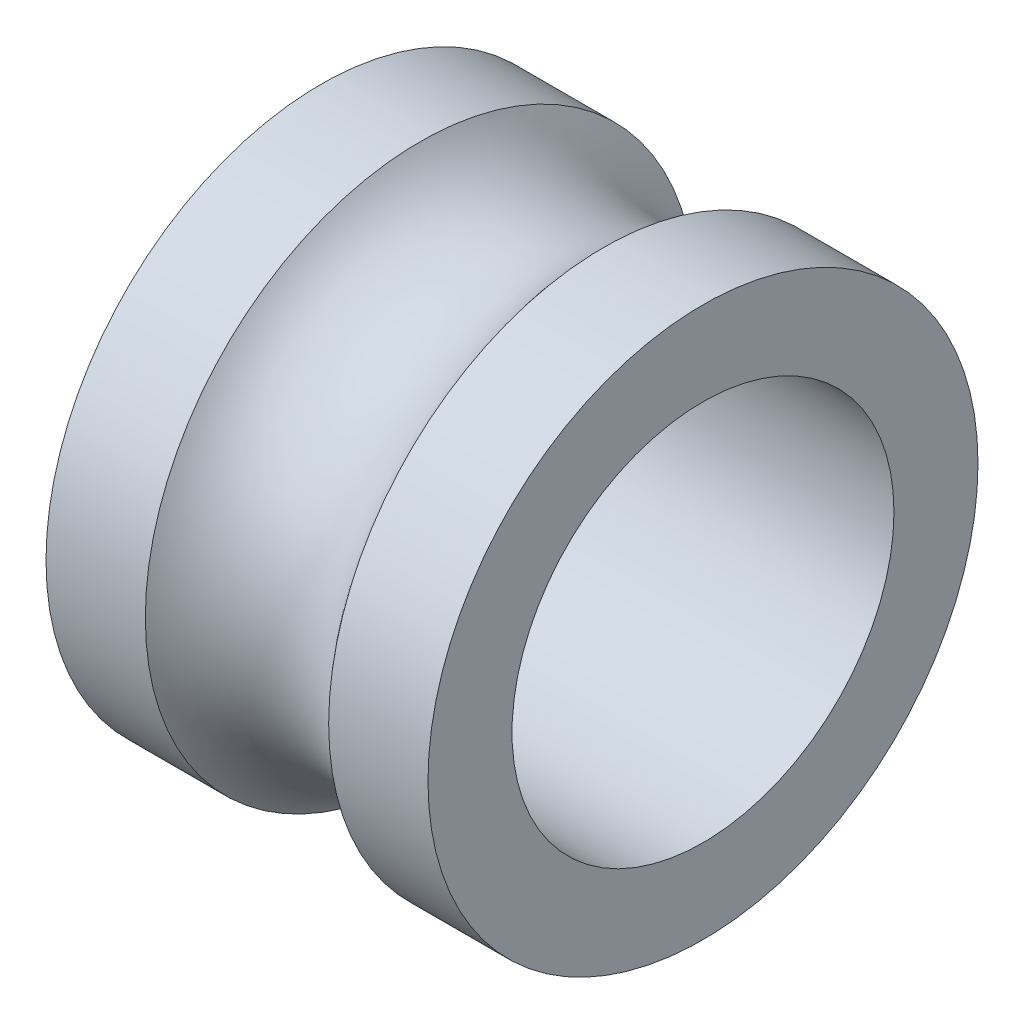
ISO-10303-21;
HEADER;
FILE_DESCRIPTION(('STEP AP214'),'2;1');
FILE_NAME('part.step','',(''),(''),'','','');
FILE_SCHEMA(('AUTOMOTIVE_DESIGN { 1 0 10303 214 1 1 1 1 }'));
ENDSEC;
DATA;
#1=APPLICATION_CONTEXT('core data for automotive mechanical design processes');
#2=APPLICATION_PROTOCOL_DEFINITION('international standard','automotive_design',2000,#1);
#3=PRODUCT_CONTEXT('',#1,'mechanical');
#4=PRODUCT('Part','Part','',(#3));
#5=PRODUCT_RELATED_PRODUCT_CATEGORY('part','',(#4));
#6=PRODUCT_DEFINITION_FORMATION('','',#4);
#7=PRODUCT_DEFINITION_CONTEXT('part definition',#1,'design');
#8=PRODUCT_DEFINITION('design','',#6,#7);
#9=PRODUCT_DEFINITION_SHAPE('','',#8);
#10=(LENGTH_UNIT() NAMED_UNIT(*) SI_UNIT(.MILLI.,.METRE.));
#11=(NAMED_UNIT(*) PLANE_ANGLE_UNIT() SI_UNIT($,.RADIAN.));
#12=(NAMED_UNIT(*) SI_UNIT($,.STERADIAN.) SOLID_ANGLE_UNIT());
#13=UNCERTAINTY_MEASURE_WITH_UNIT(LENGTH_MEASURE(1.E-05),#10,'distance_accuracy_value','');
#14=(GEOMETRIC_REPRESENTATION_CONTEXT(3) GLOBAL_UNCERTAINTY_ASSIGNED_CONTEXT((#13)) GLOBAL_UNIT_ASSIGNED_CONTEXT((#10,
#11,#12)) REPRESENTATION_CONTEXT('',''));
#15=CARTESIAN_POINT('',(0.,0.,0.));
#16=DIRECTION('',(0.,0.,1.));
#17=DIRECTION('',(1.,0.,0.));
#18=AXIS2_PLACEMENT_3D('',#15,#16,#17);
#19=CARTESIAN_POINT('',(2.5,3.6,0.));
#20=DIRECTION('',(1.,0.,0.));
#21=DIRECTION('',(0.,0.,-1.));
#22=AXIS2_PLACEMENT_3D('',#19,#20,#21);
#23=PLANE('',#22);
#24=CARTESIAN_POINT('',(2.5,0.,0.));
#25=DIRECTION('',(1.,0.,0.));
#26=DIRECTION('',(0.,0.,-1.));
#27=AXIS2_PLACEMENT_3D('',#24,#25,#26);
#28=CIRCLE('',#27,3.6);
#29=CARTESIAN_POINT('',(2.5,0.,-3.6));
#30=VERTEX_POINT('',#29);
#31=EDGE_CURVE('E52',#30,#30,#28,.T.);
#32=ORIENTED_EDGE('',*,*,#31,.T.);
#33=EDGE_LOOP('',(#32));
#34=FACE_BOUND('',#33,.T.);
#35=CARTESIAN_POINT('',(2.5,0.,0.));
#36=DIRECTION('',(1.,0.,0.));
#37=DIRECTION('',(0.,0.,-1.));
#38=AXIS2_PLACEMENT_3D('',#35,#36,#37);
#39=CIRCLE('',#38,2.5);
#40=CARTESIAN_POINT('',(2.5,0.,-2.5));
#41=VERTEX_POINT('',#40);
#42=EDGE_CURVE('E10',#41,#41,#39,.T.);
#43=ORIENTED_EDGE('',*,*,#42,.F.);
#44=EDGE_LOOP('',(#43));
#45=FACE_BOUND('',#44,.T.);
#46=ADVANCED_FACE('F30',(#34,#45),#23,.T.);
#47=CARTESIAN_POINT('',(0.,0.,0.));
#48=DIRECTION('',(1.,0.,0.));
#49=DIRECTION('',(0.,0.,-1.));
#50=AXIS2_PLACEMENT_3D('',#47,#48,#49);
#51=CYLINDRICAL_SURFACE('',#50,2.5);
#52=ORIENTED_EDGE('',*,*,#42,.T.);
#53=EDGE_LOOP('',(#52));
#54=FACE_BOUND('',#53,.T.);
#55=CARTESIAN_POINT('',(-2.5,0.,0.));
#56=DIRECTION('',(1.,0.,0.));
#57=DIRECTION('',(0.,0.,-1.));
#58=AXIS2_PLACEMENT_3D('',#55,#56,#57);
#59=CIRCLE('',#58,2.5);
#60=CARTESIAN_POINT('',(-2.5,0.,-2.5));
#61=VERTEX_POINT('',#60);
#62=EDGE_CURVE('E36',#61,#61,#59,.T.);
#63=ORIENTED_EDGE('',*,*,#62,.F.);
#64=EDGE_LOOP('',(#63));
#65=FACE_BOUND('',#64,.T.);
#66=ADVANCED_FACE('F70',(#54,#65),#51,.F.);
#67=CARTESIAN_POINT('',(-2.5,2.5,0.));
#68=DIRECTION('',(-1.,0.,0.));
#69=DIRECTION('',(0.,0.,1.));
#70=AXIS2_PLACEMENT_3D('',#67,#68,#69);
#71=PLANE('',#70);
#72=ORIENTED_EDGE('',*,*,#62,.T.);
#73=EDGE_LOOP('',(#72));
#74=FACE_BOUND('',#73,.T.);
#75=CARTESIAN_POINT('',(-2.5,0.,0.));
#76=DIRECTION('',(1.,0.,0.));
#77=DIRECTION('',(0.,0.,-1.));
#78=AXIS2_PLACEMENT_3D('',#75,#76,#77);
#79=CIRCLE('',#78,3.6);
#80=CARTESIAN_POINT('',(-2.5,0.,-3.6));
#81=VERTEX_POINT('',#80);
#82=EDGE_CURVE('E40',#81,#81,#79,.T.);
#83=ORIENTED_EDGE('',*,*,#82,.F.);
#84=EDGE_LOOP('',(#83));
#85=FACE_BOUND('',#84,.T.);
#86=ADVANCED_FACE('F74',(#74,#85),#71,.T.);
#87=CARTESIAN_POINT('',(0.,0.,0.));
#88=DIRECTION('',(1.,0.,0.));
#89=DIRECTION('',(0.,0.,-1.));
#90=AXIS2_PLACEMENT_3D('',#87,#88,#89);
#91=CYLINDRICAL_SURFACE('',#90,3.6);
#92=ORIENTED_EDGE('',*,*,#82,.T.);
#93=EDGE_LOOP('',(#92));
#94=FACE_BOUND('',#93,.T.);
#95=CARTESIAN_POINT('',(-1.2,0.,0.));
#96=DIRECTION('',(1.,0.,0.));
#97=DIRECTION('',(0.,0.,-1.));
#98=AXIS2_PLACEMENT_3D('',#95,#96,#97);
#99=CIRCLE('',#98,3.6);
#100=CARTESIAN_POINT('',(-1.2,0.,-3.6));
#101=VERTEX_POINT('',#100);
#102=EDGE_CURVE('E44',#101,#101,#99,.T.);
#103=ORIENTED_EDGE('',*,*,#102,.F.);
#104=EDGE_LOOP('',(#103));
#105=FACE_BOUND('',#104,.T.);
#106=ADVANCED_FACE('F66',(#94,#105),#91,.T.);
#107=CARTESIAN_POINT('',(0.,0.,0.));
#108=DIRECTION('',(1.,0.,0.));
#109=DIRECTION('',(0.,0.,-1.));
#110=AXIS2_PLACEMENT_3D('',#107,#108,#109);
#111=TOROIDAL_SURFACE('',#110,4.5,1.5);
#112=ORIENTED_EDGE('',*,*,#102,.T.);
#113=EDGE_LOOP('',(#112));
#114=FACE_BOUND('',#113,.T.);
#115=CARTESIAN_POINT('',(1.2,0.,0.));
#116=DIRECTION('',(1.,0.,0.));
#117=DIRECTION('',(0.,0.,-1.));
#118=AXIS2_PLACEMENT_3D('',#115,#116,#117);
#119=CIRCLE('',#118,3.6);
#120=CARTESIAN_POINT('',(1.2,0.,-3.6));
#121=VERTEX_POINT('',#120);
#122=EDGE_CURVE('E49',#121,#121,#119,.T.);
#123=ORIENTED_EDGE('',*,*,#122,.F.);
#124=EDGE_LOOP('',(#123));
#125=FACE_BOUND('',#124,.T.);
#126=ADVANCED_FACE('F60',(#114,#125),#111,.F.);
#127=CARTESIAN_POINT('',(0.,0.,0.));
#128=DIRECTION('',(1.,0.,0.));
#129=DIRECTION('',(0.,0.,-1.));
#130=AXIS2_PLACEMENT_3D('',#127,#128,#129);
#131=CYLINDRICAL_SURFACE('',#130,3.6);
#132=ORIENTED_EDGE('',*,*,#122,.T.);
#133=EDGE_LOOP('',(#132));
#134=FACE_BOUND('',#133,.T.);
#135=ORIENTED_EDGE('',*,*,#31,.F.);
#136=EDGE_LOOP('',(#135));
#137=FACE_BOUND('',#136,.T.);
#138=ADVANCED_FACE('F58',(#134,#137),#131,.T.);
#139=CLOSED_SHELL('',(#46,#66,#86,#106,#126,#138));
#140=MANIFOLD_SOLID_BREP('B2',#139);
#141=ADVANCED_BREP_SHAPE_REPRESENTATION('',(#18,#140),#14);
#142=SHAPE_DEFINITION_REPRESENTATION(#9,#141);
ENDSEC;
END-ISO-10303-21;
